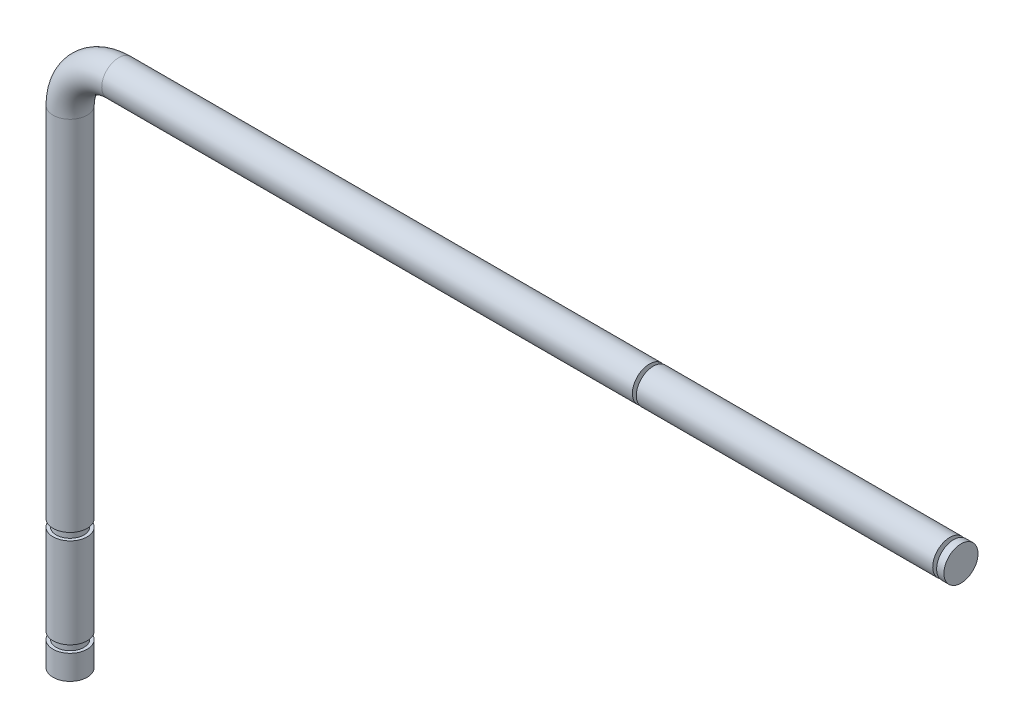
ISO-10303-21;
HEADER;
FILE_DESCRIPTION(('STEP AP214'),'2;1');
FILE_NAME('part.step','',(''),(''),'','','');
FILE_SCHEMA(('AUTOMOTIVE_DESIGN { 1 0 10303 214 1 1 1 1 }'));
ENDSEC;
DATA;
#1=APPLICATION_CONTEXT('core data for automotive mechanical design processes');
#2=APPLICATION_PROTOCOL_DEFINITION('international standard','automotive_design',2000,#1);
#3=PRODUCT_CONTEXT('',#1,'mechanical');
#4=PRODUCT('Part','Part','',(#3));
#5=PRODUCT_RELATED_PRODUCT_CATEGORY('part','',(#4));
#6=PRODUCT_DEFINITION_FORMATION('','',#4);
#7=PRODUCT_DEFINITION_CONTEXT('part definition',#1,'design');
#8=PRODUCT_DEFINITION('design','',#6,#7);
#9=PRODUCT_DEFINITION_SHAPE('','',#8);
#10=(LENGTH_UNIT() NAMED_UNIT(*) SI_UNIT(.MILLI.,.METRE.));
#11=(NAMED_UNIT(*) PLANE_ANGLE_UNIT() SI_UNIT($,.RADIAN.));
#12=(NAMED_UNIT(*) SI_UNIT($,.STERADIAN.) SOLID_ANGLE_UNIT());
#13=UNCERTAINTY_MEASURE_WITH_UNIT(LENGTH_MEASURE(1.E-05),#10,'distance_accuracy_value','');
#14=(GEOMETRIC_REPRESENTATION_CONTEXT(3) GLOBAL_UNCERTAINTY_ASSIGNED_CONTEXT((#13)) GLOBAL_UNIT_ASSIGNED_CONTEXT((#10,
#11,#12)) REPRESENTATION_CONTEXT('',''));
#15=CARTESIAN_POINT('',(0.,0.,0.));
#16=DIRECTION('',(0.,0.,1.));
#17=DIRECTION('',(1.,0.,0.));
#18=AXIS2_PLACEMENT_3D('',#15,#16,#17);
#19=CARTESIAN_POINT('',(183.,0.,0.));
#20=DIRECTION('',(-1.,0.,0.));
#21=DIRECTION('',(0.,0.,1.));
#22=AXIS2_PLACEMENT_3D('',#19,#20,#21);
#23=CYLINDRICAL_SURFACE('',#22,3.5);
#24=CARTESIAN_POINT('',(10.0000000000001,0.,0.));
#25=DIRECTION('',(1.,0.,0.));
#26=DIRECTION('',(0.,1.,0.));
#27=AXIS2_PLACEMENT_3D('',#24,#25,#26);
#28=CIRCLE('',#27,3.5);
#29=CARTESIAN_POINT('',(10.0000000000001,3.5,0.));
#30=VERTEX_POINT('',#29);
#31=EDGE_CURVE('E166',#30,#30,#28,.T.);
#32=ORIENTED_EDGE('',*,*,#31,.T.);
#33=EDGE_LOOP('',(#32));
#34=FACE_BOUND('',#33,.T.);
#35=CARTESIAN_POINT('',(119.,0.,0.));
#36=DIRECTION('',(1.,0.,0.));
#37=DIRECTION('',(0.,1.,0.));
#38=AXIS2_PLACEMENT_3D('',#35,#36,#37);
#39=CIRCLE('',#38,3.5);
#40=CARTESIAN_POINT('',(119.,3.5,0.));
#41=VERTEX_POINT('',#40);
#42=EDGE_CURVE('E132',#41,#41,#39,.T.);
#43=ORIENTED_EDGE('',*,*,#42,.F.);
#44=EDGE_LOOP('',(#43));
#45=FACE_BOUND('',#44,.T.);
#46=ADVANCED_FACE('F47',(#34,#45),#23,.T.);
#47=CARTESIAN_POINT('',(0.,-10.0000000000001,0.));
#48=DIRECTION('',(0.,-1.,0.));
#49=DIRECTION('',(1.,0.,0.));
#50=AXIS2_PLACEMENT_3D('',#47,#48,#49);
#51=CYLINDRICAL_SURFACE('',#50,3.5);
#52=CARTESIAN_POINT('',(0.,-85.,0.));
#53=DIRECTION('',(0.,-1.,0.));
#54=DIRECTION('',(1.,0.,0.));
#55=AXIS2_PLACEMENT_3D('',#52,#53,#54);
#56=CIRCLE('',#55,3.5);
#57=CARTESIAN_POINT('',(3.50000000000001,-85.,0.));
#58=VERTEX_POINT('',#57);
#59=EDGE_CURVE('E155',#58,#58,#56,.T.);
#60=CARTESIAN_POINT('',(0.,-103.5,0.));
#61=DIRECTION('',(0.,-1.,0.));
#62=DIRECTION('',(1.,0.,0.));
#63=AXIS2_PLACEMENT_3D('',#60,#61,#62);
#64=CIRCLE('',#63,3.5);
#65=CARTESIAN_POINT('',(3.50000000000001,-103.5,0.));
#66=VERTEX_POINT('',#65);
#67=EDGE_CURVE('E167',#66,#66,#64,.T.);
#68=CARTESIAN_POINT('',(3.50000000000001,-85.,0.));
#69=CARTESIAN_POINT('',(3.50000000000001,-85.1927083333333,0.));
#70=CARTESIAN_POINT('',(3.50000000000001,-85.3854166666666,0.));
#71=CARTESIAN_POINT('',(3.50000000000001,-85.7708333333333,0.));
#72=CARTESIAN_POINT('',(3.50000000000001,-85.9635416666666,0.));
#73=CARTESIAN_POINT('',(3.50000000000001,-86.3489583333333,0.));
#74=CARTESIAN_POINT('',(3.50000000000001,-86.5416666666666,0.));
#75=CARTESIAN_POINT('',(3.50000000000001,-86.9270833333333,0.));
#76=CARTESIAN_POINT('',(3.50000000000001,-87.1197916666666,0.));
#77=CARTESIAN_POINT('',(3.50000000000001,-87.5052083333333,0.));
#78=CARTESIAN_POINT('',(3.50000000000001,-87.6979166666666,0.));
#79=CARTESIAN_POINT('',(3.50000000000001,-88.0833333333333,0.));
#80=CARTESIAN_POINT('',(3.50000000000001,-88.2760416666666,0.));
#81=CARTESIAN_POINT('',(3.50000000000001,-88.6614583333333,0.));
#82=CARTESIAN_POINT('',(3.50000000000001,-88.8541666666666,0.));
#83=CARTESIAN_POINT('',(3.50000000000001,-89.2395833333333,0.));
#84=CARTESIAN_POINT('',(3.50000000000001,-89.4322916666666,0.));
#85=CARTESIAN_POINT('',(3.50000000000001,-89.8177083333333,0.));
#86=CARTESIAN_POINT('',(3.50000000000001,-90.0104166666666,0.));
#87=CARTESIAN_POINT('',(3.50000000000001,-90.3958333333333,0.));
#88=CARTESIAN_POINT('',(3.50000000000001,-90.5885416666666,0.));
#89=CARTESIAN_POINT('',(3.50000000000001,-90.9739583333333,0.));
#90=CARTESIAN_POINT('',(3.50000000000001,-91.1666666666666,0.));
#91=CARTESIAN_POINT('',(3.50000000000001,-91.5520833333333,0.));
#92=CARTESIAN_POINT('',(3.50000000000001,-91.7447916666666,0.));
#93=CARTESIAN_POINT('',(3.50000000000001,-92.1302083333333,0.));
#94=CARTESIAN_POINT('',(3.50000000000001,-92.3229166666666,0.));
#95=CARTESIAN_POINT('',(3.50000000000001,-92.7083333333333,0.));
#96=CARTESIAN_POINT('',(3.50000000000001,-92.9010416666666,0.));
#97=CARTESIAN_POINT('',(3.50000000000001,-93.2864583333333,0.));
#98=CARTESIAN_POINT('',(3.50000000000001,-93.4791666666666,0.));
#99=CARTESIAN_POINT('',(3.50000000000001,-93.8645833333333,0.));
#100=CARTESIAN_POINT('',(3.50000000000001,-94.0572916666666,0.));
#101=CARTESIAN_POINT('',(3.50000000000001,-94.4427083333333,0.));
#102=CARTESIAN_POINT('',(3.50000000000001,-94.6354166666666,0.));
#103=CARTESIAN_POINT('',(3.50000000000001,-95.0208333333333,0.));
#104=CARTESIAN_POINT('',(3.50000000000001,-95.2135416666666,0.));
#105=CARTESIAN_POINT('',(3.50000000000001,-95.5989583333333,0.));
#106=CARTESIAN_POINT('',(3.50000000000001,-95.7916666666666,0.));
#107=CARTESIAN_POINT('',(3.50000000000001,-96.1770833333333,0.));
#108=CARTESIAN_POINT('',(3.50000000000001,-96.3697916666666,0.));
#109=CARTESIAN_POINT('',(3.50000000000001,-96.7552083333333,0.));
#110=CARTESIAN_POINT('',(3.50000000000001,-96.9479166666666,0.));
#111=CARTESIAN_POINT('',(3.50000000000001,-97.3333333333333,0.));
#112=CARTESIAN_POINT('',(3.50000000000001,-97.5260416666666,0.));
#113=CARTESIAN_POINT('',(3.50000000000001,-97.9114583333333,0.));
#114=CARTESIAN_POINT('',(3.50000000000001,-98.1041666666666,0.));
#115=CARTESIAN_POINT('',(3.50000000000001,-98.4895833333333,0.));
#116=CARTESIAN_POINT('',(3.50000000000001,-98.6822916666666,0.));
#117=CARTESIAN_POINT('',(3.50000000000001,-99.0677083333333,0.));
#118=CARTESIAN_POINT('',(3.50000000000001,-99.2604166666666,0.));
#119=CARTESIAN_POINT('',(3.50000000000001,-99.6458333333333,0.));
#120=CARTESIAN_POINT('',(3.50000000000001,-99.8385416666666,0.));
#121=CARTESIAN_POINT('',(3.50000000000001,-100.223958333333,0.));
#122=CARTESIAN_POINT('',(3.50000000000001,-100.416666666667,0.));
#123=CARTESIAN_POINT('',(3.50000000000001,-100.802083333333,0.));
#124=CARTESIAN_POINT('',(3.50000000000001,-100.994791666667,0.));
#125=CARTESIAN_POINT('',(3.50000000000001,-101.380208333333,0.));
#126=CARTESIAN_POINT('',(3.50000000000001,-101.572916666667,0.));
#127=CARTESIAN_POINT('',(3.50000000000001,-101.958333333333,0.));
#128=CARTESIAN_POINT('',(3.50000000000001,-102.151041666667,0.));
#129=CARTESIAN_POINT('',(3.50000000000001,-102.536458333333,0.));
#130=CARTESIAN_POINT('',(3.50000000000001,-102.729166666667,0.));
#131=CARTESIAN_POINT('',(3.50000000000001,-103.114583333333,0.));
#132=CARTESIAN_POINT('',(3.50000000000001,-103.307291666667,0.));
#133=CARTESIAN_POINT('',(3.50000000000001,-103.5,0.));
#134=B_SPLINE_CURVE_WITH_KNOTS('',3,(#68,#69,#70,#71,#72,#73,#74,#75,#76,#77,#78,#79,#80,#81,
#82,#83,#84,#85,#86,#87,#88,#89,#90,#91,#92,#93,#94,#95,#96,#97,#98,#99,#100,#101,#102,#103,
#104,#105,#106,#107,#108,#109,#110,#111,#112,#113,#114,#115,#116,#117,#118,#119,#120,#121,#122,
#123,#124,#125,#126,#127,#128,#129,#130,#131,#132,#133),.UNSPECIFIED.,.F.,.F.,(4,2,2,2,2,2,2,2,
2,2,2,2,2,2,2,2,2,2,2,2,2,2,2,2,2,2,2,2,2,2,2,2,4),(0.,0.578124999999999,1.15625,1.734375,
2.3125,2.89062499999999,3.46874999999999,4.04687499999999,4.62499999999999,5.203125,5.78125,
6.359375,6.9375,7.515625,8.09375,8.671875,9.24999999999999,9.82812499999999,10.40625,10.984375,
11.5625,12.140625,12.71875,13.296875,13.875,14.453125,15.03125,15.609375,16.1875,16.765625,
17.34375,17.921875,18.5),.UNSPECIFIED.);
#135=EDGE_CURVE('BSEAM80',#58,#66,#134,.T.);
#136=ORIENTED_EDGE('',*,*,#59,.T.);
#137=ORIENTED_EDGE('',*,*,#67,.F.);
#138=ORIENTED_EDGE('',*,*,#135,.T.);
#139=ORIENTED_EDGE('',*,*,#135,.F.);
#140=EDGE_LOOP('',(#136,#138,#137,#139));
#141=FACE_BOUND('',#140,.T.);
#142=ADVANCED_FACE('F80',(#141),#51,.T.);
#143=CARTESIAN_POINT('',(0.,-103.5,0.));
#144=DIRECTION('',(0.,-1.,0.));
#145=DIRECTION('',(1.,0.,0.));
#146=AXIS2_PLACEMENT_3D('',#143,#144,#145);
#147=PLANE('',#146);
#148=CARTESIAN_POINT('',(0.,-103.5,0.));
#149=DIRECTION('',(0.,-1.,0.));
#150=DIRECTION('',(1.,0.,0.));
#151=AXIS2_PLACEMENT_3D('',#148,#149,#150);
#152=CIRCLE('',#151,2.85);
#153=CARTESIAN_POINT('',(2.85000000000001,-103.5,0.));
#154=VERTEX_POINT('',#153);
#155=EDGE_CURVE('E158',#154,#154,#152,.T.);
#156=ORIENTED_EDGE('',*,*,#155,.F.);
#157=EDGE_LOOP('',(#156));
#158=FACE_BOUND('',#157,.T.);
#159=ORIENTED_EDGE('',*,*,#67,.T.);
#160=EDGE_LOOP('',(#159));
#161=FACE_BOUND('',#160,.T.);
#162=ADVANCED_FACE('F94',(#158,#161),#147,.T.);
#163=CARTESIAN_POINT('',(0.,-105.,0.));
#164=DIRECTION('',(0.,-1.,0.));
#165=DIRECTION('',(1.,0.,0.));
#166=AXIS2_PLACEMENT_3D('',#163,#164,#165);
#167=PLANE('',#166);
#168=CARTESIAN_POINT('',(0.,-105.,0.));
#169=DIRECTION('',(0.,-1.,0.));
#170=DIRECTION('',(1.,0.,0.));
#171=AXIS2_PLACEMENT_3D('',#168,#169,#170);
#172=CIRCLE('',#171,2.85);
#173=CARTESIAN_POINT('',(2.85000000000001,-105.,0.));
#174=VERTEX_POINT('',#173);
#175=EDGE_CURVE('E162',#174,#174,#172,.T.);
#176=ORIENTED_EDGE('',*,*,#175,.T.);
#177=EDGE_LOOP('',(#176));
#178=FACE_BOUND('',#177,.T.);
#179=CARTESIAN_POINT('',(0.,-105.,0.));
#180=DIRECTION('',(0.,-1.,0.));
#181=DIRECTION('',(1.,0.,0.));
#182=AXIS2_PLACEMENT_3D('',#179,#180,#181);
#183=CIRCLE('',#182,3.5);
#184=CARTESIAN_POINT('',(3.50000000000001,-105.,0.));
#185=VERTEX_POINT('',#184);
#186=EDGE_CURVE('E161',#185,#185,#183,.T.);
#187=ORIENTED_EDGE('',*,*,#186,.F.);
#188=EDGE_LOOP('',(#187));
#189=FACE_BOUND('',#188,.T.);
#190=ADVANCED_FACE('F82',(#178,#189),#167,.F.);
#191=CARTESIAN_POINT('',(0.,-103.5,0.));
#192=DIRECTION('',(0.,-1.,0.));
#193=DIRECTION('',(1.,0.,0.));
#194=AXIS2_PLACEMENT_3D('',#191,#192,#193);
#195=CYLINDRICAL_SURFACE('',#194,2.85);
#196=ORIENTED_EDGE('',*,*,#155,.T.);
#197=EDGE_LOOP('',(#196));
#198=FACE_BOUND('',#197,.T.);
#199=ORIENTED_EDGE('',*,*,#175,.F.);
#200=EDGE_LOOP('',(#199));
#201=FACE_BOUND('',#200,.T.);
#202=ADVANCED_FACE('F69',(#198,#201),#195,.T.);
#203=CARTESIAN_POINT('',(0.,-110.,0.));
#204=DIRECTION('',(0.,1.,0.));
#205=DIRECTION('',(-1.,0.,0.));
#206=AXIS2_PLACEMENT_3D('',#203,#204,#205);
#207=PLANE('',#206);
#208=CARTESIAN_POINT('',(0.,-110.,0.));
#209=DIRECTION('',(0.,-1.,0.));
#210=DIRECTION('',(1.,0.,0.));
#211=AXIS2_PLACEMENT_3D('',#208,#209,#210);
#212=CIRCLE('',#211,1.25);
#213=CARTESIAN_POINT('',(1.25000000000001,-110.,0.));
#214=VERTEX_POINT('',#213);
#215=EDGE_CURVE('E147',#214,#214,#212,.T.);
#216=ORIENTED_EDGE('',*,*,#215,.F.);
#217=EDGE_LOOP('',(#216));
#218=FACE_BOUND('',#217,.T.);
#219=CARTESIAN_POINT('',(0.,-110.,0.));
#220=DIRECTION('',(0.,1.,0.));
#221=DIRECTION('',(-1.,0.,0.));
#222=AXIS2_PLACEMENT_3D('',#219,#220,#221);
#223=CIRCLE('',#222,3.5);
#224=CARTESIAN_POINT('',(-3.49999999999999,-110.,0.));
#225=VERTEX_POINT('',#224);
#226=EDGE_CURVE('E12',#225,#225,#223,.T.);
#227=ORIENTED_EDGE('',*,*,#226,.F.);
#228=EDGE_LOOP('',(#227));
#229=FACE_BOUND('',#228,.T.);
#230=ADVANCED_FACE('F67',(#218,#229),#207,.F.);
#231=ORIENTED_EDGE('',*,*,#186,.T.);
#232=EDGE_LOOP('',(#231));
#233=FACE_BOUND('',#232,.T.);
#234=ORIENTED_EDGE('',*,*,#226,.T.);
#235=EDGE_LOOP('',(#234));
#236=FACE_BOUND('',#235,.T.);
#237=ADVANCED_FACE('F65',(#233,#236),#51,.T.);
#238=CARTESIAN_POINT('',(0.,-83.5,0.));
#239=DIRECTION('',(0.,-1.,0.));
#240=DIRECTION('',(1.,0.,0.));
#241=AXIS2_PLACEMENT_3D('',#238,#239,#240);
#242=PLANE('',#241);
#243=CARTESIAN_POINT('',(0.,-83.5,0.));
#244=DIRECTION('',(0.,-1.,0.));
#245=DIRECTION('',(1.,0.,0.));
#246=AXIS2_PLACEMENT_3D('',#243,#244,#245);
#247=CIRCLE('',#246,2.85);
#248=CARTESIAN_POINT('',(2.85000000000001,-83.5,0.));
#249=VERTEX_POINT('',#248);
#250=EDGE_CURVE('E152',#249,#249,#247,.T.);
#251=ORIENTED_EDGE('',*,*,#250,.F.);
#252=EDGE_LOOP('',(#251));
#253=FACE_BOUND('',#252,.T.);
#254=CARTESIAN_POINT('',(0.,-83.5,0.));
#255=DIRECTION('',(0.,-1.,0.));
#256=DIRECTION('',(1.,0.,0.));
#257=AXIS2_PLACEMENT_3D('',#254,#255,#256);
#258=CIRCLE('',#257,3.5);
#259=CARTESIAN_POINT('',(3.50000000000001,-83.5,0.));
#260=VERTEX_POINT('',#259);
#261=EDGE_CURVE('E130',#260,#260,#258,.T.);
#262=ORIENTED_EDGE('',*,*,#261,.T.);
#263=EDGE_LOOP('',(#262));
#264=FACE_BOUND('',#263,.T.);
#265=ADVANCED_FACE('F76',(#253,#264),#242,.T.);
#266=CARTESIAN_POINT('',(0.,-85.,0.));
#267=DIRECTION('',(0.,-1.,0.));
#268=DIRECTION('',(1.,0.,0.));
#269=AXIS2_PLACEMENT_3D('',#266,#267,#268);
#270=PLANE('',#269);
#271=CARTESIAN_POINT('',(0.,-85.,0.));
#272=DIRECTION('',(0.,-1.,0.));
#273=DIRECTION('',(1.,0.,0.));
#274=AXIS2_PLACEMENT_3D('',#271,#272,#273);
#275=CIRCLE('',#274,2.85);
#276=CARTESIAN_POINT('',(2.85000000000001,-85.,0.));
#277=VERTEX_POINT('',#276);
#278=EDGE_CURVE('E124',#277,#277,#275,.T.);
#279=ORIENTED_EDGE('',*,*,#278,.T.);
#280=EDGE_LOOP('',(#279));
#281=FACE_BOUND('',#280,.T.);
#282=ORIENTED_EDGE('',*,*,#59,.F.);
#283=EDGE_LOOP('',(#282));
#284=FACE_BOUND('',#283,.T.);
#285=ADVANCED_FACE('F198',(#281,#284),#270,.F.);
#286=CARTESIAN_POINT('',(0.,-83.5,0.));
#287=DIRECTION('',(0.,-1.,0.));
#288=DIRECTION('',(1.,0.,0.));
#289=AXIS2_PLACEMENT_3D('',#286,#287,#288);
#290=CYLINDRICAL_SURFACE('',#289,2.85);
#291=ORIENTED_EDGE('',*,*,#250,.T.);
#292=EDGE_LOOP('',(#291));
#293=FACE_BOUND('',#292,.T.);
#294=ORIENTED_EDGE('',*,*,#278,.F.);
#295=EDGE_LOOP('',(#294));
#296=FACE_BOUND('',#295,.T.);
#297=ADVANCED_FACE('F190',(#293,#296),#290,.T.);
#298=CARTESIAN_POINT('',(10.,-10.,0.));
#299=DIRECTION('',(0.,0.,1.));
#300=DIRECTION('',(1.,0.,0.));
#301=AXIS2_PLACEMENT_3D('',#298,#299,#300);
#302=TOROIDAL_SURFACE('',#301,10.,3.5);
#303=CARTESIAN_POINT('',(-7.1125568617077E-13,-10.0000000000001,0.));
#304=DIRECTION('',(0.,1.,0.));
#305=DIRECTION('',(-1.,0.,0.));
#306=AXIS2_PLACEMENT_3D('',#303,#304,#305);
#307=CIRCLE('',#306,3.5);
#308=CARTESIAN_POINT('',(-3.5,-10.0000000000001,0.));
#309=VERTEX_POINT('',#308);
#310=EDGE_CURVE('E56',#309,#309,#307,.T.);
#311=CARTESIAN_POINT('',(10.,-10.,0.));
#312=DIRECTION('',(0.,0.,1.));
#313=DIRECTION('',(1.,0.,0.));
#314=AXIS2_PLACEMENT_3D('',#311,#312,#313);
#315=CIRCLE('',#314,13.5);
#316=EDGE_CURVE('',#30,#309,#315,.T.);
#317=ORIENTED_EDGE('',*,*,#31,.F.);
#318=ORIENTED_EDGE('',*,*,#310,.T.);
#319=ORIENTED_EDGE('',*,*,#316,.T.);
#320=ORIENTED_EDGE('',*,*,#316,.F.);
#321=EDGE_LOOP('',(#317,#319,#318,#320));
#322=FACE_BOUND('',#321,.T.);
#323=ADVANCED_FACE('F182',(#322),#302,.T.);
#324=ORIENTED_EDGE('',*,*,#310,.F.);
#325=EDGE_LOOP('',(#324));
#326=FACE_BOUND('',#325,.T.);
#327=ORIENTED_EDGE('',*,*,#261,.F.);
#328=EDGE_LOOP('',(#327));
#329=FACE_BOUND('',#328,.T.);
#330=ADVANCED_FACE('F79',(#326,#329),#51,.T.);
#331=CARTESIAN_POINT('',(119.8,9.61367321494494E-13,1.58727198051878E-13));
#332=DIRECTION('',(1.,0.,0.));
#333=DIRECTION('',(0.,1.,0.));
#334=AXIS2_PLACEMENT_3D('',#331,#332,#333);
#335=PLANE('',#334);
#336=CARTESIAN_POINT('',(119.8,9.61367321494494E-13,1.58727198051878E-13));
#337=DIRECTION('',(1.,0.,0.));
#338=DIRECTION('',(0.,1.,0.));
#339=AXIS2_PLACEMENT_3D('',#336,#337,#338);
#340=CIRCLE('',#339,1.6);
#341=CARTESIAN_POINT('',(119.8,1.60000000000096,1.58727198051878E-13));
#342=VERTEX_POINT('',#341);
#343=EDGE_CURVE('E134',#342,#342,#340,.T.);
#344=ORIENTED_EDGE('',*,*,#343,.T.);
#345=EDGE_LOOP('',(#344));
#346=FACE_BOUND('',#345,.T.);
#347=CARTESIAN_POINT('',(119.8,0.,0.));
#348=DIRECTION('',(1.,0.,0.));
#349=DIRECTION('',(0.,1.,0.));
#350=AXIS2_PLACEMENT_3D('',#347,#348,#349);
#351=CIRCLE('',#350,3.5);
#352=CARTESIAN_POINT('',(119.8,3.5,0.));
#353=VERTEX_POINT('',#352);
#354=EDGE_CURVE('E51',#353,#353,#351,.T.);
#355=ORIENTED_EDGE('',*,*,#354,.F.);
#356=EDGE_LOOP('',(#355));
#357=FACE_BOUND('',#356,.T.);
#358=ADVANCED_FACE('F181',(#346,#357),#335,.F.);
#359=CARTESIAN_POINT('',(119.,9.61367321494494E-13,1.58727198051878E-13));
#360=DIRECTION('',(1.,0.,0.));
#361=DIRECTION('',(0.,1.,0.));
#362=AXIS2_PLACEMENT_3D('',#359,#360,#361);
#363=PLANE('',#362);
#364=CARTESIAN_POINT('',(119.,9.61367321494494E-13,1.58727198051878E-13));
#365=DIRECTION('',(1.,0.,0.));
#366=DIRECTION('',(0.,1.,0.));
#367=AXIS2_PLACEMENT_3D('',#364,#365,#366);
#368=CIRCLE('',#367,1.6);
#369=CARTESIAN_POINT('',(119.,1.60000000000096,1.58727198051878E-13));
#370=VERTEX_POINT('',#369);
#371=EDGE_CURVE('E139',#370,#370,#368,.T.);
#372=ORIENTED_EDGE('',*,*,#371,.F.);
#373=EDGE_LOOP('',(#372));
#374=FACE_BOUND('',#373,.T.);
#375=ORIENTED_EDGE('',*,*,#42,.T.);
#376=EDGE_LOOP('',(#375));
#377=FACE_BOUND('',#376,.T.);
#378=ADVANCED_FACE('F188',(#374,#377),#363,.T.);
#379=CARTESIAN_POINT('',(119.8,9.61367321494494E-13,1.58727198051878E-13));
#380=DIRECTION('',(-1.,0.,0.));
#381=DIRECTION('',(0.,-1.,0.));
#382=AXIS2_PLACEMENT_3D('',#379,#380,#381);
#383=CYLINDRICAL_SURFACE('',#382,1.6);
#384=ORIENTED_EDGE('',*,*,#343,.F.);
#385=EDGE_LOOP('',(#384));
#386=FACE_BOUND('',#385,.T.);
#387=ORIENTED_EDGE('',*,*,#371,.T.);
#388=EDGE_LOOP('',(#387));
#389=FACE_BOUND('',#388,.T.);
#390=ADVANCED_FACE('F114',(#386,#389),#383,.T.);
#391=CARTESIAN_POINT('',(183.,0.,0.));
#392=DIRECTION('',(1.,0.,0.));
#393=DIRECTION('',(0.,1.,0.));
#394=AXIS2_PLACEMENT_3D('',#391,#392,#393);
#395=PLANE('',#394);
#396=CARTESIAN_POINT('',(183.,0.,0.));
#397=DIRECTION('',(1.,0.,0.));
#398=DIRECTION('',(0.,1.,0.));
#399=AXIS2_PLACEMENT_3D('',#396,#397,#398);
#400=CIRCLE('',#399,3.5);
#401=CARTESIAN_POINT('',(183.,3.5,0.));
#402=VERTEX_POINT('',#401);
#403=EDGE_CURVE('E62',#402,#402,#400,.T.);
#404=ORIENTED_EDGE('',*,*,#403,.T.);
#405=EDGE_LOOP('',(#404));
#406=FACE_BOUND('',#405,.T.);
#407=ADVANCED_FACE('F49',(#406),#395,.T.);
#408=CARTESIAN_POINT('',(181.5,0.,0.));
#409=DIRECTION('',(1.,0.,0.));
#410=DIRECTION('',(0.,1.,0.));
#411=AXIS2_PLACEMENT_3D('',#408,#409,#410);
#412=CIRCLE('',#411,3.5);
#413=CARTESIAN_POINT('',(181.5,3.5,0.));
#414=VERTEX_POINT('',#413);
#415=EDGE_CURVE('E118',#414,#414,#412,.T.);
#416=ORIENTED_EDGE('',*,*,#415,.T.);
#417=EDGE_LOOP('',(#416));
#418=FACE_BOUND('',#417,.T.);
#419=ORIENTED_EDGE('',*,*,#403,.F.);
#420=EDGE_LOOP('',(#419));
#421=FACE_BOUND('',#420,.T.);
#422=ADVANCED_FACE('F90',(#418,#421),#23,.T.);
#423=CARTESIAN_POINT('',(181.5,0.,0.));
#424=DIRECTION('',(1.,0.,0.));
#425=DIRECTION('',(0.,1.,0.));
#426=AXIS2_PLACEMENT_3D('',#423,#424,#425);
#427=PLANE('',#426);
#428=CARTESIAN_POINT('',(181.5,0.,0.));
#429=DIRECTION('',(1.,0.,0.));
#430=DIRECTION('',(0.,1.,0.));
#431=AXIS2_PLACEMENT_3D('',#428,#429,#430);
#432=CIRCLE('',#431,1.6);
#433=CARTESIAN_POINT('',(181.5,1.6,0.));
#434=VERTEX_POINT('',#433);
#435=EDGE_CURVE('E127',#434,#434,#432,.T.);
#436=ORIENTED_EDGE('',*,*,#435,.T.);
#437=EDGE_LOOP('',(#436));
#438=FACE_BOUND('',#437,.T.);
#439=ORIENTED_EDGE('',*,*,#415,.F.);
#440=EDGE_LOOP('',(#439));
#441=FACE_BOUND('',#440,.T.);
#442=ADVANCED_FACE('F105',(#438,#441),#427,.F.);
#443=CARTESIAN_POINT('',(180.7,0.,0.));
#444=DIRECTION('',(1.,0.,0.));
#445=DIRECTION('',(0.,1.,0.));
#446=AXIS2_PLACEMENT_3D('',#443,#444,#445);
#447=CYLINDRICAL_SURFACE('',#446,1.6);
#448=CARTESIAN_POINT('',(180.7,0.,0.));
#449=DIRECTION('',(1.,0.,0.));
#450=DIRECTION('',(0.,1.,0.));
#451=AXIS2_PLACEMENT_3D('',#448,#449,#450);
#452=CIRCLE('',#451,1.6);
#453=CARTESIAN_POINT('',(180.7,1.6,0.));
#454=VERTEX_POINT('',#453);
#455=EDGE_CURVE('E121',#454,#454,#452,.T.);
#456=ORIENTED_EDGE('',*,*,#455,.T.);
#457=EDGE_LOOP('',(#456));
#458=FACE_BOUND('',#457,.T.);
#459=ORIENTED_EDGE('',*,*,#435,.F.);
#460=EDGE_LOOP('',(#459));
#461=FACE_BOUND('',#460,.T.);
#462=ADVANCED_FACE('F111',(#458,#461),#447,.T.);
#463=CARTESIAN_POINT('',(180.7,0.,0.));
#464=DIRECTION('',(1.,0.,0.));
#465=DIRECTION('',(0.,1.,0.));
#466=AXIS2_PLACEMENT_3D('',#463,#464,#465);
#467=PLANE('',#466);
#468=ORIENTED_EDGE('',*,*,#455,.F.);
#469=EDGE_LOOP('',(#468));
#470=FACE_BOUND('',#469,.T.);
#471=CARTESIAN_POINT('',(180.7,0.,0.));
#472=DIRECTION('',(1.,0.,0.));
#473=DIRECTION('',(0.,1.,0.));
#474=AXIS2_PLACEMENT_3D('',#471,#472,#473);
#475=CIRCLE('',#474,3.5);
#476=CARTESIAN_POINT('',(180.7,3.5,0.));
#477=VERTEX_POINT('',#476);
#478=EDGE_CURVE('E120',#477,#477,#475,.T.);
#479=ORIENTED_EDGE('',*,*,#478,.T.);
#480=EDGE_LOOP('',(#479));
#481=FACE_BOUND('',#480,.T.);
#482=ADVANCED_FACE('F102',(#470,#481),#467,.T.);
#483=ORIENTED_EDGE('',*,*,#354,.T.);
#484=EDGE_LOOP('',(#483));
#485=FACE_BOUND('',#484,.T.);
#486=ORIENTED_EDGE('',*,*,#478,.F.);
#487=EDGE_LOOP('',(#486));
#488=FACE_BOUND('',#487,.T.);
#489=ADVANCED_FACE('F89',(#485,#488),#23,.T.);
#490=CARTESIAN_POINT('',(0.,-100.,0.));
#491=DIRECTION('',(0.,-1.,0.));
#492=DIRECTION('',(1.,0.,0.));
#493=AXIS2_PLACEMENT_3D('',#490,#491,#492);
#494=CYLINDRICAL_SURFACE('',#493,1.25);
#495=CARTESIAN_POINT('',(0.,-100.,0.));
#496=DIRECTION('',(0.,-1.,0.));
#497=DIRECTION('',(1.,0.,0.));
#498=AXIS2_PLACEMENT_3D('',#495,#496,#497);
#499=CIRCLE('',#498,1.25);
#500=CARTESIAN_POINT('',(1.25000000000001,-100.,0.));
#501=VERTEX_POINT('',#500);
#502=EDGE_CURVE('E144',#501,#501,#499,.T.);
#503=ORIENTED_EDGE('',*,*,#502,.F.);
#504=EDGE_LOOP('',(#503));
#505=FACE_BOUND('',#504,.T.);
#506=ORIENTED_EDGE('',*,*,#215,.T.);
#507=EDGE_LOOP('',(#506));
#508=FACE_BOUND('',#507,.T.);
#509=ADVANCED_FACE('F101',(#505,#508),#494,.F.);
#510=CARTESIAN_POINT('',(0.,-100.,0.));
#511=DIRECTION('',(0.,-1.,0.));
#512=DIRECTION('',(1.,0.,0.));
#513=AXIS2_PLACEMENT_3D('',#510,#511,#512);
#514=PLANE('',#513);
#515=ORIENTED_EDGE('',*,*,#502,.T.);
#516=EDGE_LOOP('',(#515));
#517=FACE_BOUND('',#516,.T.);
#518=ADVANCED_FACE('F323',(#517),#514,.T.);
#519=CLOSED_SHELL('',(#46,#142,#162,#190,#202,#230,#237,#265,#285,#297,#323,#330,#358,#378,#390,
#407,#422,#442,#462,#482,#489,#509,#518));
#520=MANIFOLD_SOLID_BREP('B2',#519);
#521=ADVANCED_BREP_SHAPE_REPRESENTATION('',(#18,#520),#14);
#522=SHAPE_DEFINITION_REPRESENTATION(#9,#521);
ENDSEC;
END-ISO-10303-21;
